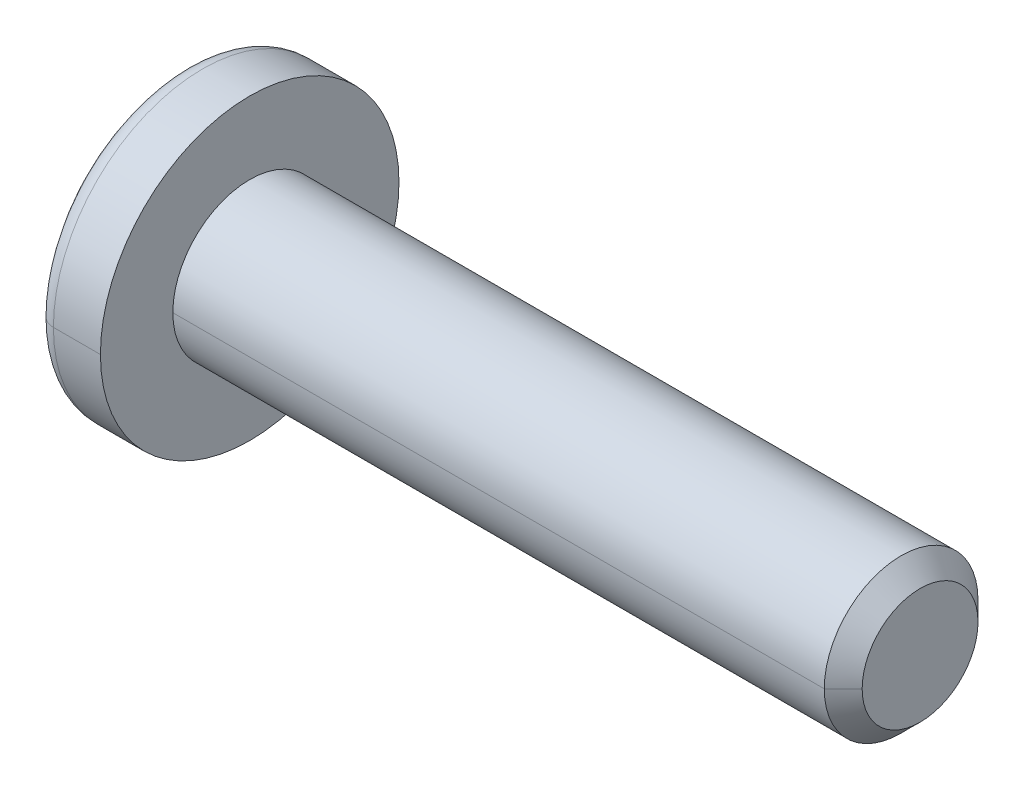
ISO-10303-21;
HEADER;
FILE_DESCRIPTION(('STEP AP214'),'2;1');
FILE_NAME('part.step','',(''),(''),'','','');
FILE_SCHEMA(('AUTOMOTIVE_DESIGN { 1 0 10303 214 1 1 1 1 }'));
ENDSEC;
DATA;
#1=APPLICATION_CONTEXT('core data for automotive mechanical design processes');
#2=APPLICATION_PROTOCOL_DEFINITION('international standard','automotive_design',2000,#1);
#3=PRODUCT_CONTEXT('',#1,'mechanical');
#4=PRODUCT('Part','Part','',(#3));
#5=PRODUCT_RELATED_PRODUCT_CATEGORY('part','',(#4));
#6=PRODUCT_DEFINITION_FORMATION('','',#4);
#7=PRODUCT_DEFINITION_CONTEXT('part definition',#1,'design');
#8=PRODUCT_DEFINITION('design','',#6,#7);
#9=PRODUCT_DEFINITION_SHAPE('','',#8);
#10=(LENGTH_UNIT() NAMED_UNIT(*) SI_UNIT(.MILLI.,.METRE.));
#11=(NAMED_UNIT(*) PLANE_ANGLE_UNIT() SI_UNIT($,.RADIAN.));
#12=(NAMED_UNIT(*) SI_UNIT($,.STERADIAN.) SOLID_ANGLE_UNIT());
#13=UNCERTAINTY_MEASURE_WITH_UNIT(LENGTH_MEASURE(1.E-05),#10,'distance_accuracy_value','');
#14=(GEOMETRIC_REPRESENTATION_CONTEXT(3) GLOBAL_UNCERTAINTY_ASSIGNED_CONTEXT((#13)) GLOBAL_UNIT_ASSIGNED_CONTEXT((#10,
#11,#12)) REPRESENTATION_CONTEXT('',''));
#15=CARTESIAN_POINT('',(0.,0.,0.));
#16=DIRECTION('',(0.,0.,1.));
#17=DIRECTION('',(1.,0.,0.));
#18=AXIS2_PLACEMENT_3D('',#15,#16,#17);
#19=CARTESIAN_POINT('',(-0.334022400521806,0.,0.));
#20=DIRECTION('',(1.,0.,0.));
#21=DIRECTION('',(0.,0.,1.));
#22=AXIS2_PLACEMENT_3D('',#19,#20,#21);
#23=CYLINDRICAL_SURFACE('',#22,2.1209);
#24=DIRECTION('',(1.,0.,0.));
#25=VECTOR('',#24,1.);
#26=CARTESIAN_POINT('',(-0.334022400521806,0.,2.1209));
#27=LINE('',#26,#25);
#28=CARTESIAN_POINT('',(-0.668044801043612,0.,2.1209));
#29=VERTEX_POINT('',#28);
#30=CARTESIAN_POINT('',(0.,0.,2.1209));
#31=VERTEX_POINT('',#30);
#32=EDGE_CURVE('E26',#29,#31,#27,.T.);
#33=ORIENTED_EDGE('',*,*,#32,.F.);
#34=CARTESIAN_POINT('',(-0.668044801043611,0.,0.));
#35=DIRECTION('',(1.,0.,0.));
#36=DIRECTION('',(0.,0.,1.));
#37=AXIS2_PLACEMENT_3D('',#34,#35,#36);
#38=CIRCLE('',#37,2.1209);
#39=CARTESIAN_POINT('',(-0.668044801043611,0.,-2.1209));
#40=VERTEX_POINT('',#39);
#41=EDGE_CURVE('E247',#29,#40,#38,.T.);
#42=ORIENTED_EDGE('',*,*,#41,.T.);
#43=DIRECTION('',(-1.,0.,0.));
#44=VECTOR('',#43,1.);
#45=CARTESIAN_POINT('',(-0.334022400521805,0.,-2.1209));
#46=LINE('',#45,#44);
#47=CARTESIAN_POINT('',(0.,0.,-2.1209));
#48=VERTEX_POINT('',#47);
#49=EDGE_CURVE('E10',#48,#40,#46,.T.);
#50=ORIENTED_EDGE('',*,*,#49,.F.);
#51=CARTESIAN_POINT('',(0.,0.,0.));
#52=DIRECTION('',(1.,0.,0.));
#53=DIRECTION('',(0.,0.,1.));
#54=AXIS2_PLACEMENT_3D('',#51,#52,#53);
#55=CIRCLE('',#54,2.1209);
#56=EDGE_CURVE('E279',#31,#48,#55,.T.);
#57=ORIENTED_EDGE('',*,*,#56,.F.);
#58=EDGE_LOOP('',(#33,#42,#50,#57));
#59=FACE_BOUND('',#58,.T.);
#60=ADVANCED_FACE('F15',(#59),#23,.T.);
#61=CARTESIAN_POINT('',(-0.334022400521806,0.,0.));
#62=DIRECTION('',(1.,0.,0.));
#63=DIRECTION('',(0.,0.,1.));
#64=AXIS2_PLACEMENT_3D('',#61,#62,#63);
#65=CYLINDRICAL_SURFACE('',#64,2.1209);
#66=ORIENTED_EDGE('',*,*,#32,.T.);
#67=CARTESIAN_POINT('',(0.,0.,0.));
#68=DIRECTION('',(1.,0.,0.));
#69=DIRECTION('',(0.,0.,1.));
#70=AXIS2_PLACEMENT_3D('',#67,#68,#69);
#71=CIRCLE('',#70,2.1209);
#72=EDGE_CURVE('E250',#48,#31,#71,.T.);
#73=ORIENTED_EDGE('',*,*,#72,.F.);
#74=ORIENTED_EDGE('',*,*,#49,.T.);
#75=CARTESIAN_POINT('',(-0.668044801043611,0.,0.));
#76=DIRECTION('',(1.,0.,0.));
#77=DIRECTION('',(0.,0.,1.));
#78=AXIS2_PLACEMENT_3D('',#75,#76,#77);
#79=CIRCLE('',#78,2.1209);
#80=EDGE_CURVE('E275',#40,#29,#79,.T.);
#81=ORIENTED_EDGE('',*,*,#80,.T.);
#82=EDGE_LOOP('',(#66,#73,#74,#81));
#83=FACE_BOUND('',#82,.T.);
#84=ADVANCED_FACE('F456',(#83),#65,.T.);
#85=CARTESIAN_POINT('',(-0.668044801043611,0.,0.));
#86=DIRECTION('',(1.,0.,0.));
#87=DIRECTION('',(0.,0.,-1.));
#88=AXIS2_PLACEMENT_3D('',#85,#86,#87);
#89=TOROIDAL_SURFACE('',#88,1.8669,0.254);
#90=CARTESIAN_POINT('',(-0.66804480104361,0.,-1.8669));
#91=DIRECTION('',(0.,-1.,0.));
#92=DIRECTION('',(0.,0.,-1.));
#93=AXIS2_PLACEMENT_3D('',#90,#91,#92);
#94=CIRCLE('',#93,0.254);
#95=CARTESIAN_POINT('',(-0.866705762537756,0.,-2.02517135678392));
#96=VERTEX_POINT('',#95);
#97=EDGE_CURVE('E242',#96,#40,#94,.T.);
#98=ORIENTED_EDGE('',*,*,#97,.T.);
#99=ORIENTED_EDGE('',*,*,#41,.F.);
#100=CARTESIAN_POINT('',(-0.668044801043611,0.,1.8669));
#101=DIRECTION('',(0.,-1.,0.));
#102=DIRECTION('',(0.,0.,1.));
#103=AXIS2_PLACEMENT_3D('',#100,#101,#102);
#104=CIRCLE('',#103,0.254);
#105=CARTESIAN_POINT('',(-0.866705762537756,0.,2.02517135678392));
#106=VERTEX_POINT('',#105);
#107=EDGE_CURVE('E246',#29,#106,#104,.T.);
#108=ORIENTED_EDGE('',*,*,#107,.T.);
#109=CARTESIAN_POINT('',(-0.866705762537756,0.,0.));
#110=DIRECTION('',(1.,0.,0.));
#111=DIRECTION('',(0.,0.,1.));
#112=AXIS2_PLACEMENT_3D('',#109,#110,#111);
#113=CIRCLE('',#112,2.02517135678392);
#114=EDGE_CURVE('E169',#106,#96,#113,.T.);
#115=ORIENTED_EDGE('',*,*,#114,.T.);
#116=EDGE_LOOP('',(#98,#99,#108,#115));
#117=FACE_BOUND('',#116,.T.);
#118=ADVANCED_FACE('F461',(#117),#89,.T.);
#119=CARTESIAN_POINT('',(0.,0.,1.06045));
#120=DIRECTION('',(1.,0.,0.));
#121=DIRECTION('',(0.,0.,1.));
#122=AXIS2_PLACEMENT_3D('',#119,#120,#121);
#123=PLANE('',#122);
#124=ORIENTED_EDGE('',*,*,#56,.T.);
#125=ORIENTED_EDGE('',*,*,#72,.T.);
#126=EDGE_LOOP('',(#124,#125));
#127=FACE_BOUND('',#126,.T.);
#128=CARTESIAN_POINT('',(0.,0.,0.));
#129=DIRECTION('',(-1.,0.,0.));
#130=DIRECTION('',(0.,0.,-1.));
#131=AXIS2_PLACEMENT_3D('',#128,#129,#130);
#132=CIRCLE('',#131,1.0922);
#133=CARTESIAN_POINT('',(0.,0.,-1.0922));
#134=VERTEX_POINT('',#133);
#135=CARTESIAN_POINT('',(0.,0.,1.0922));
#136=VERTEX_POINT('',#135);
#137=EDGE_CURVE('E158',#134,#136,#132,.T.);
#138=ORIENTED_EDGE('',*,*,#137,.T.);
#139=CARTESIAN_POINT('',(0.,0.,0.));
#140=DIRECTION('',(-1.,0.,0.));
#141=DIRECTION('',(0.,0.,-1.));
#142=AXIS2_PLACEMENT_3D('',#139,#140,#141);
#143=CIRCLE('',#142,1.0922);
#144=EDGE_CURVE('E19',#136,#134,#143,.T.);
#145=ORIENTED_EDGE('',*,*,#144,.T.);
#146=EDGE_LOOP('',(#138,#145));
#147=FACE_BOUND('',#146,.T.);
#148=ADVANCED_FACE('F171',(#127,#147),#123,.T.);
#149=CARTESIAN_POINT('',(-0.668044801043611,0.,0.));
#150=DIRECTION('',(1.,0.,0.));
#151=DIRECTION('',(0.,0.,-1.));
#152=AXIS2_PLACEMENT_3D('',#149,#150,#151);
#153=TOROIDAL_SURFACE('',#152,1.8669,0.254);
#154=ORIENTED_EDGE('',*,*,#97,.F.);
#155=CARTESIAN_POINT('',(-0.866705762537756,0.,0.));
#156=DIRECTION('',(1.,0.,0.));
#157=DIRECTION('',(0.,0.,1.));
#158=AXIS2_PLACEMENT_3D('',#155,#156,#157);
#159=CIRCLE('',#158,2.02517135678392);
#160=EDGE_CURVE('E187',#96,#106,#159,.T.);
#161=ORIENTED_EDGE('',*,*,#160,.T.);
#162=ORIENTED_EDGE('',*,*,#107,.F.);
#163=ORIENTED_EDGE('',*,*,#80,.F.);
#164=EDGE_LOOP('',(#154,#161,#162,#163));
#165=FACE_BOUND('',#164,.T.);
#166=ADVANCED_FACE('F384',(#165),#153,.T.);
#167=CARTESIAN_POINT('',(1.67527338709678,0.,0.));
#168=DIRECTION('',(0.,0.,1.));
#169=DIRECTION('',(1.,0.,0.));
#170=AXIS2_PLACEMENT_3D('',#167,#168,#169);
#171=SPHERICAL_SURFACE('',#170,3.25007338709678);
#172=CARTESIAN_POINT('',(1.67527338709678,0.,0.));
#173=DIRECTION('',(0.,-1.,0.));
#174=DIRECTION('',(0.,0.,1.));
#175=AXIS2_PLACEMENT_3D('',#172,#173,#174);
#176=CIRCLE('',#175,3.25007338709678);
#177=CARTESIAN_POINT('',(-1.33228366332051,0.,1.2319));
#178=VERTEX_POINT('',#177);
#179=EDGE_CURVE('E193',#106,#178,#176,.T.);
#180=ORIENTED_EDGE('',*,*,#179,.T.);
#181=CARTESIAN_POINT('',(1.67527338709678,0.,1.2319));
#182=DIRECTION('',(0.,0.,1.));
#183=DIRECTION('',(0.,1.,0.));
#184=AXIS2_PLACEMENT_3D('',#181,#182,#183);
#185=CIRCLE('',#184,3.00755705041729);
#186=CARTESIAN_POINT('',(-1.32452437300552,-0.2159,1.2319));
#187=VERTEX_POINT('',#186);
#188=EDGE_CURVE('E195',#178,#187,#185,.T.);
#189=ORIENTED_EDGE('',*,*,#188,.T.);
#190=CARTESIAN_POINT('',(1.67527338709678,-0.2159,0.));
#191=DIRECTION('',(0.,-1.,0.));
#192=DIRECTION('',(0.,0.,1.));
#193=AXIS2_PLACEMENT_3D('',#190,#191,#192);
#194=CIRCLE('',#193,3.24289441880471);
#195=CARTESIAN_POINT('',(-1.5604261356517,-0.2159,0.2159));
#196=VERTEX_POINT('',#195);
#197=EDGE_CURVE('E266',#187,#196,#194,.T.);
#198=ORIENTED_EDGE('',*,*,#197,.T.);
#199=CARTESIAN_POINT('',(1.67527338709678,0.,0.2159));
#200=DIRECTION('',(0.,0.,1.));
#201=DIRECTION('',(0.,1.,0.));
#202=AXIS2_PLACEMENT_3D('',#199,#200,#201);
#203=CIRCLE('',#202,3.24289441880471);
#204=CARTESIAN_POINT('',(-1.32452437300552,-1.2319,0.2159));
#205=VERTEX_POINT('',#204);
#206=EDGE_CURVE('E237',#196,#205,#203,.T.);
#207=ORIENTED_EDGE('',*,*,#206,.T.);
#208=CARTESIAN_POINT('',(1.67527338709678,-1.2319,0.));
#209=DIRECTION('',(0.,-1.,0.));
#210=DIRECTION('',(0.,0.,1.));
#211=AXIS2_PLACEMENT_3D('',#208,#209,#210);
#212=CIRCLE('',#211,3.00755705041729);
#213=CARTESIAN_POINT('',(-1.32452437300552,-1.2319,-0.2159));
#214=VERTEX_POINT('',#213);
#215=EDGE_CURVE('E238',#205,#214,#212,.T.);
#216=ORIENTED_EDGE('',*,*,#215,.T.);
#217=CARTESIAN_POINT('',(1.67527338709678,0.,-0.2159));
#218=DIRECTION('',(0.,0.,-1.));
#219=DIRECTION('',(0.,-1.,0.));
#220=AXIS2_PLACEMENT_3D('',#217,#218,#219);
#221=CIRCLE('',#220,3.24289441880471);
#222=CARTESIAN_POINT('',(-1.5604261356517,-0.2159,-0.2159));
#223=VERTEX_POINT('',#222);
#224=EDGE_CURVE('E304',#214,#223,#221,.T.);
#225=ORIENTED_EDGE('',*,*,#224,.T.);
#226=CARTESIAN_POINT('',(1.67527338709678,-0.2159,0.));
#227=DIRECTION('',(0.,-1.,0.));
#228=DIRECTION('',(0.,0.,1.));
#229=AXIS2_PLACEMENT_3D('',#226,#227,#228);
#230=CIRCLE('',#229,3.24289441880471);
#231=CARTESIAN_POINT('',(-1.32452437300552,-0.2159,-1.2319));
#232=VERTEX_POINT('',#231);
#233=EDGE_CURVE('E200',#223,#232,#230,.T.);
#234=ORIENTED_EDGE('',*,*,#233,.T.);
#235=CARTESIAN_POINT('',(1.67527338709678,0.,-1.2319));
#236=DIRECTION('',(0.,0.,-1.));
#237=DIRECTION('',(0.,-1.,0.));
#238=AXIS2_PLACEMENT_3D('',#235,#236,#237);
#239=CIRCLE('',#238,3.00755705041729);
#240=CARTESIAN_POINT('',(-1.33228366332051,0.,-1.2319));
#241=VERTEX_POINT('',#240);
#242=EDGE_CURVE('E342',#232,#241,#239,.T.);
#243=ORIENTED_EDGE('',*,*,#242,.T.);
#244=CARTESIAN_POINT('',(1.67527338709678,0.,0.));
#245=DIRECTION('',(0.,-1.,0.));
#246=DIRECTION('',(0.,0.,1.));
#247=AXIS2_PLACEMENT_3D('',#244,#245,#246);
#248=CIRCLE('',#247,3.25007338709678);
#249=EDGE_CURVE('E180',#241,#96,#248,.T.);
#250=ORIENTED_EDGE('',*,*,#249,.T.);
#251=ORIENTED_EDGE('',*,*,#114,.F.);
#252=EDGE_LOOP('',(#180,#189,#198,#207,#216,#225,#234,#243,#250,#251));
#253=FACE_BOUND('',#252,.T.);
#254=ADVANCED_FACE('F392',(#253),#171,.T.);
#255=CARTESIAN_POINT('',(4.7625,0.,0.));
#256=DIRECTION('',(-1.,0.,0.));
#257=DIRECTION('',(0.,0.,-1.));
#258=AXIS2_PLACEMENT_3D('',#255,#256,#257);
#259=CYLINDRICAL_SURFACE('',#258,1.0922);
#260=DIRECTION('',(-1.,0.,0.));
#261=VECTOR('',#260,1.);
#262=CARTESIAN_POINT('',(4.7625,0.,-1.0922));
#263=LINE('',#262,#261);
#264=CARTESIAN_POINT('',(9.25576,0.,-1.0922));
#265=VERTEX_POINT('',#264);
#266=EDGE_CURVE('E163',#265,#134,#263,.T.);
#267=ORIENTED_EDGE('',*,*,#266,.F.);
#268=CARTESIAN_POINT('',(9.25576,0.,0.));
#269=DIRECTION('',(-1.,0.,0.));
#270=DIRECTION('',(0.,0.,-1.));
#271=AXIS2_PLACEMENT_3D('',#268,#269,#270);
#272=CIRCLE('',#271,1.0922);
#273=CARTESIAN_POINT('',(9.25576,0.,1.0922));
#274=VERTEX_POINT('',#273);
#275=EDGE_CURVE('E211',#265,#274,#272,.T.);
#276=ORIENTED_EDGE('',*,*,#275,.T.);
#277=DIRECTION('',(1.,0.,0.));
#278=VECTOR('',#277,1.);
#279=CARTESIAN_POINT('',(4.7625,0.,1.0922));
#280=LINE('',#279,#278);
#281=EDGE_CURVE('E165',#136,#274,#280,.T.);
#282=ORIENTED_EDGE('',*,*,#281,.F.);
#283=ORIENTED_EDGE('',*,*,#137,.F.);
#284=EDGE_LOOP('',(#267,#276,#282,#283));
#285=FACE_BOUND('',#284,.T.);
#286=ADVANCED_FACE('F160',(#285),#259,.T.);
#287=CARTESIAN_POINT('',(4.7625,0.,0.));
#288=DIRECTION('',(-1.,0.,0.));
#289=DIRECTION('',(0.,0.,-1.));
#290=AXIS2_PLACEMENT_3D('',#287,#288,#289);
#291=CYLINDRICAL_SURFACE('',#290,1.0922);
#292=ORIENTED_EDGE('',*,*,#266,.T.);
#293=ORIENTED_EDGE('',*,*,#144,.F.);
#294=ORIENTED_EDGE('',*,*,#281,.T.);
#295=CARTESIAN_POINT('',(9.25576,0.,0.));
#296=DIRECTION('',(-1.,0.,0.));
#297=DIRECTION('',(0.,0.,-1.));
#298=AXIS2_PLACEMENT_3D('',#295,#296,#297);
#299=CIRCLE('',#298,1.0922);
#300=EDGE_CURVE('E177',#274,#265,#299,.T.);
#301=ORIENTED_EDGE('',*,*,#300,.T.);
#302=EDGE_LOOP('',(#292,#293,#294,#301));
#303=FACE_BOUND('',#302,.T.);
#304=ADVANCED_FACE('F175',(#303),#291,.T.);
#305=CARTESIAN_POINT('',(1.67527338709678,0.,0.));
#306=DIRECTION('',(0.,0.,1.));
#307=DIRECTION('',(1.,0.,0.));
#308=AXIS2_PLACEMENT_3D('',#305,#306,#307);
#309=SPHERICAL_SURFACE('',#308,3.25007338709678);
#310=ORIENTED_EDGE('',*,*,#179,.F.);
#311=ORIENTED_EDGE('',*,*,#160,.F.);
#312=ORIENTED_EDGE('',*,*,#249,.F.);
#313=CARTESIAN_POINT('',(1.67527338709678,0.,-1.2319));
#314=DIRECTION('',(0.,0.,-1.));
#315=DIRECTION('',(0.,-1.,0.));
#316=AXIS2_PLACEMENT_3D('',#313,#314,#315);
#317=CIRCLE('',#316,3.00755705041729);
#318=CARTESIAN_POINT('',(-1.32452437300552,0.2159,-1.2319));
#319=VERTEX_POINT('',#318);
#320=EDGE_CURVE('E201',#241,#319,#317,.T.);
#321=ORIENTED_EDGE('',*,*,#320,.T.);
#322=CARTESIAN_POINT('',(1.67527338709678,0.2159,0.));
#323=DIRECTION('',(0.,1.,0.));
#324=DIRECTION('',(0.,0.,-1.));
#325=AXIS2_PLACEMENT_3D('',#322,#323,#324);
#326=CIRCLE('',#325,3.24289441880471);
#327=CARTESIAN_POINT('',(-1.5604261356517,0.2159,-0.2159));
#328=VERTEX_POINT('',#327);
#329=EDGE_CURVE('E213',#319,#328,#326,.T.);
#330=ORIENTED_EDGE('',*,*,#329,.T.);
#331=CARTESIAN_POINT('',(1.67527338709678,0.,-0.2159));
#332=DIRECTION('',(0.,0.,-1.));
#333=DIRECTION('',(0.,-1.,0.));
#334=AXIS2_PLACEMENT_3D('',#331,#332,#333);
#335=CIRCLE('',#334,3.24289441880471);
#336=CARTESIAN_POINT('',(-1.32452437300552,1.2319,-0.2159));
#337=VERTEX_POINT('',#336);
#338=EDGE_CURVE('E271',#328,#337,#335,.T.);
#339=ORIENTED_EDGE('',*,*,#338,.T.);
#340=CARTESIAN_POINT('',(1.67527338709678,1.2319,0.));
#341=DIRECTION('',(0.,1.,0.));
#342=DIRECTION('',(0.,0.,-1.));
#343=AXIS2_PLACEMENT_3D('',#340,#341,#342);
#344=CIRCLE('',#343,3.00755705041729);
#345=CARTESIAN_POINT('',(-1.32452437300552,1.2319,0.2159));
#346=VERTEX_POINT('',#345);
#347=EDGE_CURVE('E270',#337,#346,#344,.T.);
#348=ORIENTED_EDGE('',*,*,#347,.T.);
#349=CARTESIAN_POINT('',(1.67527338709678,0.,0.2159));
#350=DIRECTION('',(0.,0.,1.));
#351=DIRECTION('',(0.,1.,0.));
#352=AXIS2_PLACEMENT_3D('',#349,#350,#351);
#353=CIRCLE('',#352,3.24289441880471);
#354=CARTESIAN_POINT('',(-1.5604261356517,0.2159,0.2159));
#355=VERTEX_POINT('',#354);
#356=EDGE_CURVE('E191',#346,#355,#353,.T.);
#357=ORIENTED_EDGE('',*,*,#356,.T.);
#358=CARTESIAN_POINT('',(1.67527338709678,0.2159,0.));
#359=DIRECTION('',(0.,1.,0.));
#360=DIRECTION('',(0.,0.,-1.));
#361=AXIS2_PLACEMENT_3D('',#358,#359,#360);
#362=CIRCLE('',#361,3.24289441880471);
#363=CARTESIAN_POINT('',(-1.32452437300552,0.2159,1.2319));
#364=VERTEX_POINT('',#363);
#365=EDGE_CURVE('E218',#355,#364,#362,.T.);
#366=ORIENTED_EDGE('',*,*,#365,.T.);
#367=CARTESIAN_POINT('',(1.67527338709678,0.,1.2319));
#368=DIRECTION('',(0.,0.,1.));
#369=DIRECTION('',(0.,1.,0.));
#370=AXIS2_PLACEMENT_3D('',#367,#368,#369);
#371=CIRCLE('',#370,3.00755705041729);
#372=EDGE_CURVE('E337',#364,#178,#371,.T.);
#373=ORIENTED_EDGE('',*,*,#372,.T.);
#374=EDGE_LOOP('',(#310,#311,#312,#321,#330,#339,#348,#357,#366,#373));
#375=FACE_BOUND('',#374,.T.);
#376=ADVANCED_FACE('F388',(#375),#309,.T.);
#377=CARTESIAN_POINT('',(-0.9144,0.,1.2319));
#378=DIRECTION('',(0.,0.,1.));
#379=DIRECTION('',(1.,0.,0.));
#380=AXIS2_PLACEMENT_3D('',#377,#378,#379);
#381=PLANE('',#380);
#382=ORIENTED_EDGE('',*,*,#372,.F.);
#383=DIRECTION('',(-1.,0.,0.));
#384=VECTOR('',#383,1.);
#385=CARTESIAN_POINT('',(-0.9144,0.2159,1.2319));
#386=LINE('',#385,#384);
#387=CARTESIAN_POINT('',(-0.254,0.2159,1.2319));
#388=VERTEX_POINT('',#387);
#389=EDGE_CURVE('E207',#388,#364,#386,.T.);
#390=ORIENTED_EDGE('',*,*,#389,.F.);
#391=DIRECTION('',(0.,1.,0.));
#392=VECTOR('',#391,1.);
#393=CARTESIAN_POINT('',(-0.254,0.,1.2319));
#394=LINE('',#393,#392);
#395=CARTESIAN_POINT('',(-0.254,-0.2159,1.2319));
#396=VERTEX_POINT('',#395);
#397=EDGE_CURVE('E346',#396,#388,#394,.T.);
#398=ORIENTED_EDGE('',*,*,#397,.F.);
#399=DIRECTION('',(1.,0.,0.));
#400=VECTOR('',#399,1.);
#401=CARTESIAN_POINT('',(-0.9144,-0.2159,1.2319));
#402=LINE('',#401,#400);
#403=EDGE_CURVE('E334',#187,#396,#402,.T.);
#404=ORIENTED_EDGE('',*,*,#403,.F.);
#405=ORIENTED_EDGE('',*,*,#188,.F.);
#406=EDGE_LOOP('',(#382,#390,#398,#404,#405));
#407=FACE_BOUND('',#406,.T.);
#408=ADVANCED_FACE('F395',(#407),#381,.F.);
#409=CARTESIAN_POINT('',(-0.9144,-0.2159,0.));
#410=DIRECTION('',(0.,1.,0.));
#411=DIRECTION('',(1.,0.,0.));
#412=AXIS2_PLACEMENT_3D('',#409,#410,#411);
#413=PLANE('',#412);
#414=DIRECTION('',(-1.,0.,0.));
#415=VECTOR('',#414,1.);
#416=CARTESIAN_POINT('',(-0.9144,-0.2159,0.2159));
#417=LINE('',#416,#415);
#418=CARTESIAN_POINT('',(-0.254,-0.2159,0.2159));
#419=VERTEX_POINT('',#418);
#420=EDGE_CURVE('E241',#419,#196,#417,.T.);
#421=ORIENTED_EDGE('',*,*,#420,.T.);
#422=ORIENTED_EDGE('',*,*,#197,.F.);
#423=ORIENTED_EDGE('',*,*,#403,.T.);
#424=DIRECTION('',(0.,0.,-1.));
#425=VECTOR('',#424,1.);
#426=CARTESIAN_POINT('',(-0.254,-0.2159,0.));
#427=LINE('',#426,#425);
#428=EDGE_CURVE('E226',#396,#419,#427,.T.);
#429=ORIENTED_EDGE('',*,*,#428,.T.);
#430=EDGE_LOOP('',(#421,#422,#423,#429));
#431=FACE_BOUND('',#430,.T.);
#432=ADVANCED_FACE('F403',(#431),#413,.T.);
#433=CARTESIAN_POINT('',(-0.9144,0.,0.2159));
#434=DIRECTION('',(0.,0.,-1.));
#435=DIRECTION('',(0.,-1.,0.));
#436=AXIS2_PLACEMENT_3D('',#433,#434,#435);
#437=PLANE('',#436);
#438=ORIENTED_EDGE('',*,*,#206,.F.);
#439=ORIENTED_EDGE('',*,*,#420,.F.);
#440=DIRECTION('',(0.,1.,0.));
#441=VECTOR('',#440,1.);
#442=CARTESIAN_POINT('',(-0.254,0.,0.2159));
#443=LINE('',#442,#441);
#444=CARTESIAN_POINT('',(-0.254,-1.2319,0.2159));
#445=VERTEX_POINT('',#444);
#446=EDGE_CURVE('E222',#445,#419,#443,.T.);
#447=ORIENTED_EDGE('',*,*,#446,.F.);
#448=DIRECTION('',(-1.,0.,0.));
#449=VECTOR('',#448,1.);
#450=CARTESIAN_POINT('',(-0.9144,-1.2319,0.2159));
#451=LINE('',#450,#449);
#452=EDGE_CURVE('E233',#445,#205,#451,.T.);
#453=ORIENTED_EDGE('',*,*,#452,.T.);
#454=EDGE_LOOP('',(#438,#439,#447,#453));
#455=FACE_BOUND('',#454,.T.);
#456=ADVANCED_FACE('F476',(#455),#437,.T.);
#457=CARTESIAN_POINT('',(-0.9144,-1.2319,0.));
#458=DIRECTION('',(0.,-1.,0.));
#459=DIRECTION('',(-1.,0.,0.));
#460=AXIS2_PLACEMENT_3D('',#457,#458,#459);
#461=PLANE('',#460);
#462=ORIENTED_EDGE('',*,*,#215,.F.);
#463=ORIENTED_EDGE('',*,*,#452,.F.);
#464=DIRECTION('',(0.,0.,1.));
#465=VECTOR('',#464,1.);
#466=CARTESIAN_POINT('',(-0.254,-1.2319,0.));
#467=LINE('',#466,#465);
#468=CARTESIAN_POINT('',(-0.254,-1.2319,-0.2159));
#469=VERTEX_POINT('',#468);
#470=EDGE_CURVE('E227',#469,#445,#467,.T.);
#471=ORIENTED_EDGE('',*,*,#470,.F.);
#472=DIRECTION('',(1.,0.,0.));
#473=VECTOR('',#472,1.);
#474=CARTESIAN_POINT('',(-0.9144,-1.2319,-0.2159));
#475=LINE('',#474,#473);
#476=EDGE_CURVE('E253',#214,#469,#475,.T.);
#477=ORIENTED_EDGE('',*,*,#476,.F.);
#478=EDGE_LOOP('',(#462,#463,#471,#477));
#479=FACE_BOUND('',#478,.T.);
#480=ADVANCED_FACE('F467',(#479),#461,.F.);
#481=CARTESIAN_POINT('',(-0.9144,0.,-0.2159));
#482=DIRECTION('',(0.,0.,1.));
#483=DIRECTION('',(0.,-1.,0.));
#484=AXIS2_PLACEMENT_3D('',#481,#482,#483);
#485=PLANE('',#484);
#486=ORIENTED_EDGE('',*,*,#224,.F.);
#487=ORIENTED_EDGE('',*,*,#476,.T.);
#488=DIRECTION('',(0.,1.,0.));
#489=VECTOR('',#488,1.);
#490=CARTESIAN_POINT('',(-0.254,0.,-0.2159));
#491=LINE('',#490,#489);
#492=CARTESIAN_POINT('',(-0.254,-0.2159,-0.2159));
#493=VERTEX_POINT('',#492);
#494=EDGE_CURVE('E228',#469,#493,#491,.T.);
#495=ORIENTED_EDGE('',*,*,#494,.T.);
#496=DIRECTION('',(1.,0.,0.));
#497=VECTOR('',#496,1.);
#498=CARTESIAN_POINT('',(-0.9144,-0.2159,-0.2159));
#499=LINE('',#498,#497);
#500=EDGE_CURVE('E197',#223,#493,#499,.T.);
#501=ORIENTED_EDGE('',*,*,#500,.F.);
#502=EDGE_LOOP('',(#486,#487,#495,#501));
#503=FACE_BOUND('',#502,.T.);
#504=ADVANCED_FACE('F472',(#503),#485,.T.);
#505=CARTESIAN_POINT('',(-0.9144,-0.2159,0.));
#506=DIRECTION('',(0.,1.,0.));
#507=DIRECTION('',(1.,0.,0.));
#508=AXIS2_PLACEMENT_3D('',#505,#506,#507);
#509=PLANE('',#508);
#510=ORIENTED_EDGE('',*,*,#500,.T.);
#511=DIRECTION('',(0.,0.,-1.));
#512=VECTOR('',#511,1.);
#513=CARTESIAN_POINT('',(-0.254,-0.2159,0.));
#514=LINE('',#513,#512);
#515=CARTESIAN_POINT('',(-0.254,-0.2159,-1.2319));
#516=VERTEX_POINT('',#515);
#517=EDGE_CURVE('E232',#493,#516,#514,.T.);
#518=ORIENTED_EDGE('',*,*,#517,.T.);
#519=DIRECTION('',(-1.,0.,0.));
#520=VECTOR('',#519,1.);
#521=CARTESIAN_POINT('',(-0.9144,-0.2159,-1.2319));
#522=LINE('',#521,#520);
#523=EDGE_CURVE('E338',#516,#232,#522,.T.);
#524=ORIENTED_EDGE('',*,*,#523,.T.);
#525=ORIENTED_EDGE('',*,*,#233,.F.);
#526=EDGE_LOOP('',(#510,#518,#524,#525));
#527=FACE_BOUND('',#526,.T.);
#528=ADVANCED_FACE('F475',(#527),#509,.T.);
#529=CARTESIAN_POINT('',(-0.9144,0.,-1.2319));
#530=DIRECTION('',(0.,0.,1.));
#531=DIRECTION('',(1.,0.,0.));
#532=AXIS2_PLACEMENT_3D('',#529,#530,#531);
#533=PLANE('',#532);
#534=ORIENTED_EDGE('',*,*,#242,.F.);
#535=ORIENTED_EDGE('',*,*,#523,.F.);
#536=DIRECTION('',(0.,-1.,0.));
#537=VECTOR('',#536,1.);
#538=CARTESIAN_POINT('',(-0.254,0.,-1.2319));
#539=LINE('',#538,#537);
#540=CARTESIAN_POINT('',(-0.254,0.2159,-1.2319));
#541=VERTEX_POINT('',#540);
#542=EDGE_CURVE('E258',#541,#516,#539,.T.);
#543=ORIENTED_EDGE('',*,*,#542,.F.);
#544=DIRECTION('',(1.,0.,0.));
#545=VECTOR('',#544,1.);
#546=CARTESIAN_POINT('',(-0.9144,0.2159,-1.2319));
#547=LINE('',#546,#545);
#548=EDGE_CURVE('E216',#319,#541,#547,.T.);
#549=ORIENTED_EDGE('',*,*,#548,.F.);
#550=ORIENTED_EDGE('',*,*,#320,.F.);
#551=EDGE_LOOP('',(#534,#535,#543,#549,#550));
#552=FACE_BOUND('',#551,.T.);
#553=ADVANCED_FACE('F17',(#552),#533,.T.);
#554=CARTESIAN_POINT('',(9.39038,0.,0.));
#555=DIRECTION('',(-1.,0.,0.));
#556=DIRECTION('',(0.,0.,1.));
#557=AXIS2_PLACEMENT_3D('',#554,#555,#556);
#558=CONICAL_SURFACE('',#557,0.95758,0.785398163397448);
#559=DIRECTION('',(-0.707106781186548,0.,0.707106781186548));
#560=VECTOR('',#559,1.);
#561=CARTESIAN_POINT('',(9.39038,0.,0.95758));
#562=LINE('',#561,#560);
#563=CARTESIAN_POINT('',(9.525,0.,0.82296));
#564=VERTEX_POINT('',#563);
#565=EDGE_CURVE('E327',#564,#274,#562,.T.);
#566=ORIENTED_EDGE('',*,*,#565,.T.);
#567=ORIENTED_EDGE('',*,*,#275,.F.);
#568=DIRECTION('',(0.707106781186548,0.,0.707106781186548));
#569=VECTOR('',#568,1.);
#570=CARTESIAN_POINT('',(9.39038,0.,-0.95758));
#571=LINE('',#570,#569);
#572=CARTESIAN_POINT('',(9.525,0.,-0.82296));
#573=VERTEX_POINT('',#572);
#574=EDGE_CURVE('E212',#265,#573,#571,.T.);
#575=ORIENTED_EDGE('',*,*,#574,.T.);
#576=CARTESIAN_POINT('',(9.525,0.,0.));
#577=DIRECTION('',(1.,0.,0.));
#578=DIRECTION('',(0.,0.,1.));
#579=AXIS2_PLACEMENT_3D('',#576,#577,#578);
#580=CIRCLE('',#579,0.82296);
#581=EDGE_CURVE('E374',#564,#573,#580,.T.);
#582=ORIENTED_EDGE('',*,*,#581,.F.);
#583=EDGE_LOOP('',(#566,#567,#575,#582));
#584=FACE_BOUND('',#583,.T.);
#585=ADVANCED_FACE('F523',(#584),#558,.T.);
#586=CARTESIAN_POINT('',(9.39038,0.,0.));
#587=DIRECTION('',(-1.,0.,0.));
#588=DIRECTION('',(0.,0.,1.));
#589=AXIS2_PLACEMENT_3D('',#586,#587,#588);
#590=CONICAL_SURFACE('',#589,0.95758,0.785398163397448);
#591=ORIENTED_EDGE('',*,*,#565,.F.);
#592=CARTESIAN_POINT('',(9.525,0.,0.));
#593=DIRECTION('',(1.,0.,0.));
#594=DIRECTION('',(0.,0.,1.));
#595=AXIS2_PLACEMENT_3D('',#592,#593,#594);
#596=CIRCLE('',#595,0.82296);
#597=EDGE_CURVE('E353',#573,#564,#596,.T.);
#598=ORIENTED_EDGE('',*,*,#597,.F.);
#599=ORIENTED_EDGE('',*,*,#574,.F.);
#600=ORIENTED_EDGE('',*,*,#300,.F.);
#601=EDGE_LOOP('',(#591,#598,#599,#600));
#602=FACE_BOUND('',#601,.T.);
#603=ADVANCED_FACE('F452',(#602),#590,.T.);
#604=CARTESIAN_POINT('',(-0.9144,0.2159,0.));
#605=DIRECTION('',(0.,-1.,0.));
#606=DIRECTION('',(0.,0.,-1.));
#607=AXIS2_PLACEMENT_3D('',#604,#605,#606);
#608=PLANE('',#607);
#609=DIRECTION('',(-1.,0.,0.));
#610=VECTOR('',#609,1.);
#611=CARTESIAN_POINT('',(-0.9144,0.2159,-0.2159));
#612=LINE('',#611,#610);
#613=CARTESIAN_POINT('',(-0.254,0.2159,-0.2159));
#614=VERTEX_POINT('',#613);
#615=EDGE_CURVE('E217',#614,#328,#612,.T.);
#616=ORIENTED_EDGE('',*,*,#615,.T.);
#617=ORIENTED_EDGE('',*,*,#329,.F.);
#618=ORIENTED_EDGE('',*,*,#548,.T.);
#619=DIRECTION('',(0.,0.,-1.));
#620=VECTOR('',#619,1.);
#621=CARTESIAN_POINT('',(-0.254,0.2159,0.));
#622=LINE('',#621,#620);
#623=EDGE_CURVE('E262',#614,#541,#622,.T.);
#624=ORIENTED_EDGE('',*,*,#623,.F.);
#625=EDGE_LOOP('',(#616,#617,#618,#624));
#626=FACE_BOUND('',#625,.T.);
#627=ADVANCED_FACE('F438',(#626),#608,.T.);
#628=CARTESIAN_POINT('',(-0.9144,0.,-0.2159));
#629=DIRECTION('',(0.,0.,1.));
#630=DIRECTION('',(0.,-1.,0.));
#631=AXIS2_PLACEMENT_3D('',#628,#629,#630);
#632=PLANE('',#631);
#633=ORIENTED_EDGE('',*,*,#338,.F.);
#634=ORIENTED_EDGE('',*,*,#615,.F.);
#635=DIRECTION('',(0.,1.,0.));
#636=VECTOR('',#635,1.);
#637=CARTESIAN_POINT('',(-0.254,0.,-0.2159));
#638=LINE('',#637,#636);
#639=CARTESIAN_POINT('',(-0.254,1.2319,-0.2159));
#640=VERTEX_POINT('',#639);
#641=EDGE_CURVE('E208',#614,#640,#638,.T.);
#642=ORIENTED_EDGE('',*,*,#641,.T.);
#643=DIRECTION('',(-1.,0.,0.));
#644=VECTOR('',#643,1.);
#645=CARTESIAN_POINT('',(-0.9144,1.2319,-0.2159));
#646=LINE('',#645,#644);
#647=EDGE_CURVE('E274',#640,#337,#646,.T.);
#648=ORIENTED_EDGE('',*,*,#647,.T.);
#649=EDGE_LOOP('',(#633,#634,#642,#648));
#650=FACE_BOUND('',#649,.T.);
#651=ADVANCED_FACE('F440',(#650),#632,.T.);
#652=CARTESIAN_POINT('',(-0.9144,1.2319,0.));
#653=DIRECTION('',(0.,-1.,0.));
#654=DIRECTION('',(-1.,0.,0.));
#655=AXIS2_PLACEMENT_3D('',#652,#653,#654);
#656=PLANE('',#655);
#657=ORIENTED_EDGE('',*,*,#347,.F.);
#658=ORIENTED_EDGE('',*,*,#647,.F.);
#659=DIRECTION('',(0.,0.,-1.));
#660=VECTOR('',#659,1.);
#661=CARTESIAN_POINT('',(-0.254,1.2319,0.));
#662=LINE('',#661,#660);
#663=CARTESIAN_POINT('',(-0.254,1.2319,0.2159));
#664=VERTEX_POINT('',#663);
#665=EDGE_CURVE('E284',#664,#640,#662,.T.);
#666=ORIENTED_EDGE('',*,*,#665,.F.);
#667=DIRECTION('',(1.,0.,0.));
#668=VECTOR('',#667,1.);
#669=CARTESIAN_POINT('',(-0.9144,1.2319,0.2159));
#670=LINE('',#669,#668);
#671=EDGE_CURVE('E267',#346,#664,#670,.T.);
#672=ORIENTED_EDGE('',*,*,#671,.F.);
#673=EDGE_LOOP('',(#657,#658,#666,#672));
#674=FACE_BOUND('',#673,.T.);
#675=ADVANCED_FACE('F442',(#674),#656,.T.);
#676=CARTESIAN_POINT('',(-0.9144,0.,0.2159));
#677=DIRECTION('',(0.,0.,-1.));
#678=DIRECTION('',(0.,-1.,0.));
#679=AXIS2_PLACEMENT_3D('',#676,#677,#678);
#680=PLANE('',#679);
#681=ORIENTED_EDGE('',*,*,#356,.F.);
#682=ORIENTED_EDGE('',*,*,#671,.T.);
#683=DIRECTION('',(0.,1.,0.));
#684=VECTOR('',#683,1.);
#685=CARTESIAN_POINT('',(-0.254,0.,0.2159));
#686=LINE('',#685,#684);
#687=CARTESIAN_POINT('',(-0.254,0.2159,0.2159));
#688=VERTEX_POINT('',#687);
#689=EDGE_CURVE('E280',#688,#664,#686,.T.);
#690=ORIENTED_EDGE('',*,*,#689,.F.);
#691=DIRECTION('',(1.,0.,0.));
#692=VECTOR('',#691,1.);
#693=CARTESIAN_POINT('',(-0.9144,0.2159,0.2159));
#694=LINE('',#693,#692);
#695=EDGE_CURVE('E204',#355,#688,#694,.T.);
#696=ORIENTED_EDGE('',*,*,#695,.F.);
#697=EDGE_LOOP('',(#681,#682,#690,#696));
#698=FACE_BOUND('',#697,.T.);
#699=ADVANCED_FACE('F449',(#698),#680,.T.);
#700=CARTESIAN_POINT('',(-0.9144,0.2159,0.));
#701=DIRECTION('',(0.,-1.,0.));
#702=DIRECTION('',(0.,0.,-1.));
#703=AXIS2_PLACEMENT_3D('',#700,#701,#702);
#704=PLANE('',#703);
#705=ORIENTED_EDGE('',*,*,#695,.T.);
#706=DIRECTION('',(0.,0.,-1.));
#707=VECTOR('',#706,1.);
#708=CARTESIAN_POINT('',(-0.254,0.2159,0.));
#709=LINE('',#708,#707);
#710=EDGE_CURVE('E285',#388,#688,#709,.T.);
#711=ORIENTED_EDGE('',*,*,#710,.F.);
#712=ORIENTED_EDGE('',*,*,#389,.T.);
#713=ORIENTED_EDGE('',*,*,#365,.F.);
#714=EDGE_LOOP('',(#705,#711,#712,#713));
#715=FACE_BOUND('',#714,.T.);
#716=ADVANCED_FACE('F470',(#715),#704,.T.);
#717=CARTESIAN_POINT('',(-0.254,0.,0.));
#718=DIRECTION('',(-1.,0.,0.));
#719=DIRECTION('',(0.,0.,1.));
#720=AXIS2_PLACEMENT_3D('',#717,#718,#719);
#721=PLANE('',#720);
#722=ORIENTED_EDGE('',*,*,#623,.T.);
#723=ORIENTED_EDGE('',*,*,#542,.T.);
#724=ORIENTED_EDGE('',*,*,#517,.F.);
#725=ORIENTED_EDGE('',*,*,#494,.F.);
#726=ORIENTED_EDGE('',*,*,#470,.T.);
#727=ORIENTED_EDGE('',*,*,#446,.T.);
#728=ORIENTED_EDGE('',*,*,#428,.F.);
#729=ORIENTED_EDGE('',*,*,#397,.T.);
#730=ORIENTED_EDGE('',*,*,#710,.T.);
#731=ORIENTED_EDGE('',*,*,#689,.T.);
#732=ORIENTED_EDGE('',*,*,#665,.T.);
#733=ORIENTED_EDGE('',*,*,#641,.F.);
#734=EDGE_LOOP('',(#722,#723,#724,#725,#726,#727,#728,#729,#730,#731,#732,#733));
#735=FACE_BOUND('',#734,.T.);
#736=ADVANCED_FACE('F481',(#735),#721,.T.);
#737=CARTESIAN_POINT('',(9.525,0.,-0.5461));
#738=DIRECTION('',(1.,0.,0.));
#739=DIRECTION('',(0.,0.,1.));
#740=AXIS2_PLACEMENT_3D('',#737,#738,#739);
#741=PLANE('',#740);
#742=ORIENTED_EDGE('',*,*,#581,.T.);
#743=ORIENTED_EDGE('',*,*,#597,.T.);
#744=EDGE_LOOP('',(#742,#743));
#745=FACE_BOUND('',#744,.T.);
#746=ADVANCED_FACE('F479',(#745),#741,.T.);
#747=CLOSED_SHELL('',(#60,#84,#118,#148,#166,#254,#286,#304,#376,#408,#432,#456,#480,#504,#528,
#553,#585,#603,#627,#651,#675,#699,#716,#736,#746));
#748=MANIFOLD_SOLID_BREP('B1',#747);
#749=ADVANCED_BREP_SHAPE_REPRESENTATION('',(#18,#748),#14);
#750=SHAPE_DEFINITION_REPRESENTATION(#9,#749);
ENDSEC;
END-ISO-10303-21;
